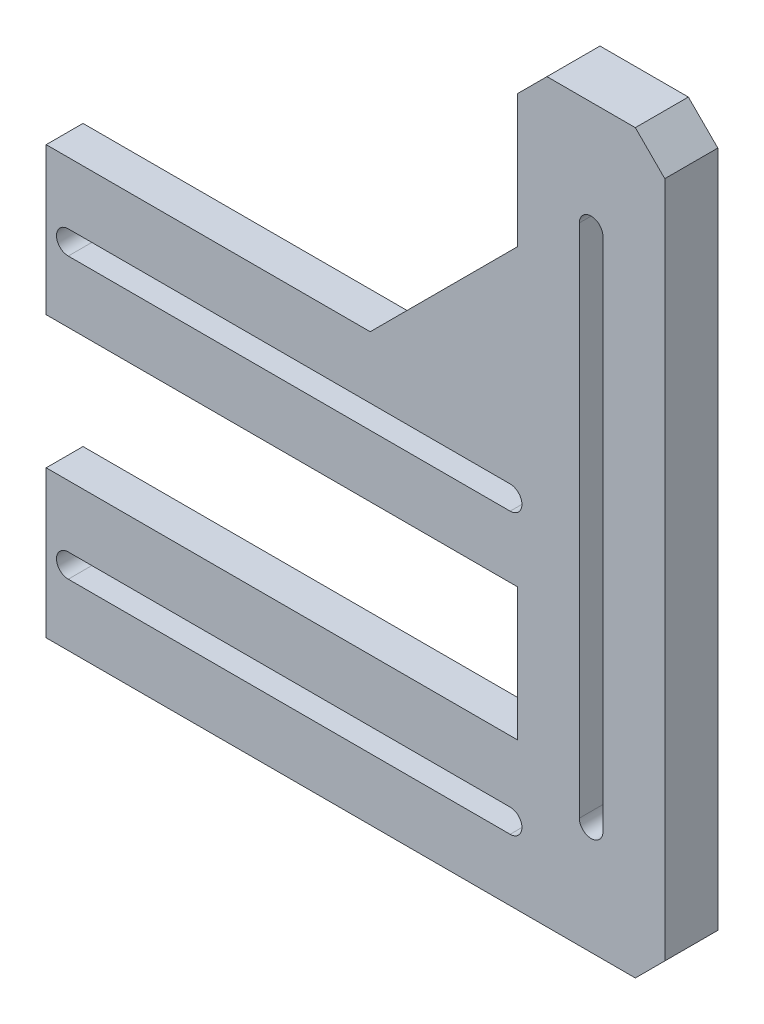
ISO-10303-21;
HEADER;
FILE_DESCRIPTION(('STEP AP214'),'2;1');
FILE_NAME('part.step','',(''),(''),'','','');
FILE_SCHEMA(('AUTOMOTIVE_DESIGN { 1 0 10303 214 1 1 1 1 }'));
ENDSEC;
DATA;
#1=APPLICATION_CONTEXT('core data for automotive mechanical design processes');
#2=APPLICATION_PROTOCOL_DEFINITION('international standard','automotive_design',2000,#1);
#3=PRODUCT_CONTEXT('',#1,'mechanical');
#4=PRODUCT('Part','Part','',(#3));
#5=PRODUCT_RELATED_PRODUCT_CATEGORY('part','',(#4));
#6=PRODUCT_DEFINITION_FORMATION('','',#4);
#7=PRODUCT_DEFINITION_CONTEXT('part definition',#1,'design');
#8=PRODUCT_DEFINITION('design','',#6,#7);
#9=PRODUCT_DEFINITION_SHAPE('','',#8);
#10=(LENGTH_UNIT() NAMED_UNIT(*) SI_UNIT(.MILLI.,.METRE.));
#11=(NAMED_UNIT(*) PLANE_ANGLE_UNIT() SI_UNIT($,.RADIAN.));
#12=(NAMED_UNIT(*) SI_UNIT($,.STERADIAN.) SOLID_ANGLE_UNIT());
#13=UNCERTAINTY_MEASURE_WITH_UNIT(LENGTH_MEASURE(1.E-05),#10,'distance_accuracy_value','');
#14=(GEOMETRIC_REPRESENTATION_CONTEXT(3) GLOBAL_UNCERTAINTY_ASSIGNED_CONTEXT((#13)) GLOBAL_UNIT_ASSIGNED_CONTEXT((#10,
#11,#12)) REPRESENTATION_CONTEXT('',''));
#15=CARTESIAN_POINT('',(0.,0.,0.));
#16=DIRECTION('',(0.,0.,1.));
#17=DIRECTION('',(1.,0.,0.));
#18=AXIS2_PLACEMENT_3D('',#15,#16,#17);
#19=CARTESIAN_POINT('',(0.,0.,5.));
#20=DIRECTION('',(0.,0.,1.));
#21=DIRECTION('',(1.,0.,0.));
#22=AXIS2_PLACEMENT_3D('',#19,#20,#21);
#23=PLANE('',#22);
#24=CARTESIAN_POINT('',(34.,14.,5.));
#25=DIRECTION('',(0.,0.,1.));
#26=DIRECTION('',(1.,0.,0.));
#27=AXIS2_PLACEMENT_3D('',#24,#25,#26);
#28=CIRCLE('',#27,1.59999999999999);
#29=CARTESIAN_POINT('',(34.,12.4,5.));
#30=VERTEX_POINT('',#29);
#31=CARTESIAN_POINT('',(34.,15.6,5.));
#32=VERTEX_POINT('',#31);
#33=EDGE_CURVE('E686',#30,#32,#28,.T.);
#34=ORIENTED_EDGE('',*,*,#33,.F.);
#35=DIRECTION('',(1.,0.,0.));
#36=VECTOR('',#35,1.);
#37=CARTESIAN_POINT('',(-26.,12.4,5.));
#38=LINE('',#37,#36);
#39=CARTESIAN_POINT('',(-26.,12.4,5.));
#40=VERTEX_POINT('',#39);
#41=EDGE_CURVE('E699',#40,#30,#38,.T.);
#42=ORIENTED_EDGE('',*,*,#41,.F.);
#43=CARTESIAN_POINT('',(-26.,14.,5.));
#44=DIRECTION('',(0.,0.,1.));
#45=DIRECTION('',(1.,0.,0.));
#46=AXIS2_PLACEMENT_3D('',#43,#44,#45);
#47=CIRCLE('',#46,1.59999999999999);
#48=CARTESIAN_POINT('',(-26.,15.6,5.));
#49=VERTEX_POINT('',#48);
#50=EDGE_CURVE('E694',#49,#40,#47,.T.);
#51=ORIENTED_EDGE('',*,*,#50,.F.);
#52=DIRECTION('',(1.,0.,0.));
#53=VECTOR('',#52,1.);
#54=CARTESIAN_POINT('',(-26.,15.6,5.));
#55=LINE('',#54,#53);
#56=EDGE_CURVE('E697',#49,#32,#55,.T.);
#57=ORIENTED_EDGE('',*,*,#56,.T.);
#58=EDGE_LOOP('',(#34,#42,#51,#57));
#59=FACE_BOUND('',#58,.T.);
#60=DIRECTION('',(-1.,0.,0.));
#61=VECTOR('',#60,1.);
#62=CARTESIAN_POINT('',(0.,66.,5.));
#63=LINE('',#62,#61);
#64=CARTESIAN_POINT('',(51.,66.,5.));
#65=VERTEX_POINT('',#64);
#66=CARTESIAN_POINT('',(39.,66.,5.));
#67=VERTEX_POINT('',#66);
#68=EDGE_CURVE('E587',#65,#67,#63,.T.);
#69=ORIENTED_EDGE('',*,*,#68,.T.);
#70=DIRECTION('',(-0.707106781186549,-0.707106781186546,0.));
#71=VECTOR('',#70,1.);
#72=CARTESIAN_POINT('',(-13.5000000000001,13.5000000000001,5.));
#73=LINE('',#72,#71);
#74=CARTESIAN_POINT('',(35.,62.,5.));
#75=VERTEX_POINT('',#74);
#76=EDGE_CURVE('E539',#67,#75,#73,.T.);
#77=ORIENTED_EDGE('',*,*,#76,.T.);
#78=DIRECTION('',(0.,1.,0.));
#79=VECTOR('',#78,1.);
#80=CARTESIAN_POINT('',(35.,0.,5.));
#81=LINE('',#80,#79);
#82=CARTESIAN_POINT('',(35.,44.,5.));
#83=VERTEX_POINT('',#82);
#84=EDGE_CURVE('E590',#83,#75,#81,.T.);
#85=ORIENTED_EDGE('',*,*,#84,.F.);
#86=DIRECTION('',(0.707106781186548,0.707106781186548,0.));
#87=VECTOR('',#86,1.);
#88=CARTESIAN_POINT('',(15.,24.,5.));
#89=LINE('',#88,#87);
#90=CARTESIAN_POINT('',(15.,24.,5.));
#91=VERTEX_POINT('',#90);
#92=EDGE_CURVE('E474',#91,#83,#89,.T.);
#93=ORIENTED_EDGE('',*,*,#92,.F.);
#94=DIRECTION('',(1.,0.,0.));
#95=VECTOR('',#94,1.);
#96=CARTESIAN_POINT('',(0.,24.,5.));
#97=LINE('',#96,#95);
#98=CARTESIAN_POINT('',(-29.,24.,5.));
#99=VERTEX_POINT('',#98);
#100=EDGE_CURVE('E482',#99,#91,#97,.T.);
#101=ORIENTED_EDGE('',*,*,#100,.F.);
#102=DIRECTION('',(0.,-1.,0.));
#103=VECTOR('',#102,1.);
#104=CARTESIAN_POINT('',(-29.,0.,5.));
#105=LINE('',#104,#103);
#106=CARTESIAN_POINT('',(-29.,4.,5.));
#107=VERTEX_POINT('',#106);
#108=EDGE_CURVE('E501',#99,#107,#105,.T.);
#109=ORIENTED_EDGE('',*,*,#108,.T.);
#110=DIRECTION('',(1.,0.,0.));
#111=VECTOR('',#110,1.);
#112=CARTESIAN_POINT('',(0.,4.,5.));
#113=LINE('',#112,#111);
#114=CARTESIAN_POINT('',(35.,4.,5.));
#115=VERTEX_POINT('',#114);
#116=EDGE_CURVE('E490',#107,#115,#113,.T.);
#117=ORIENTED_EDGE('',*,*,#116,.T.);
#118=DIRECTION('',(0.,1.,0.));
#119=VECTOR('',#118,1.);
#120=CARTESIAN_POINT('',(35.,0.,5.));
#121=LINE('',#120,#119);
#122=CARTESIAN_POINT('',(35.,-14.,5.));
#123=VERTEX_POINT('',#122);
#124=EDGE_CURVE('E577',#123,#115,#121,.T.);
#125=ORIENTED_EDGE('',*,*,#124,.F.);
#126=DIRECTION('',(1.,0.,0.));
#127=VECTOR('',#126,1.);
#128=CARTESIAN_POINT('',(0.,-14.,5.));
#129=LINE('',#128,#127);
#130=CARTESIAN_POINT('',(-29.,-14.,5.));
#131=VERTEX_POINT('',#130);
#132=EDGE_CURVE('E580',#131,#123,#129,.T.);
#133=ORIENTED_EDGE('',*,*,#132,.F.);
#134=DIRECTION('',(0.,1.,0.));
#135=VECTOR('',#134,1.);
#136=CARTESIAN_POINT('',(-29.,0.,5.));
#137=LINE('',#136,#135);
#138=CARTESIAN_POINT('',(-29.,-34.,5.));
#139=VERTEX_POINT('',#138);
#140=EDGE_CURVE('E582',#139,#131,#137,.T.);
#141=ORIENTED_EDGE('',*,*,#140,.F.);
#142=DIRECTION('',(1.,0.,0.));
#143=VECTOR('',#142,1.);
#144=CARTESIAN_POINT('',(0.,-34.,5.));
#145=LINE('',#144,#143);
#146=CARTESIAN_POINT('',(51.,-34.,5.));
#147=VERTEX_POINT('',#146);
#148=EDGE_CURVE('E584',#139,#147,#145,.T.);
#149=ORIENTED_EDGE('',*,*,#148,.T.);
#150=DIRECTION('',(0.707106781186549,0.707106781186546,0.));
#151=VECTOR('',#150,1.);
#152=CARTESIAN_POINT('',(42.4999999999999,-42.5000000000001,5.));
#153=LINE('',#152,#151);
#154=CARTESIAN_POINT('',(55.,-30.,5.));
#155=VERTEX_POINT('',#154);
#156=EDGE_CURVE('E276',#147,#155,#153,.T.);
#157=ORIENTED_EDGE('',*,*,#156,.T.);
#158=DIRECTION('',(0.,-1.,0.));
#159=VECTOR('',#158,1.);
#160=CARTESIAN_POINT('',(55.,0.,5.));
#161=LINE('',#160,#159);
#162=CARTESIAN_POINT('',(55.,62.,5.));
#163=VERTEX_POINT('',#162);
#164=EDGE_CURVE('E547',#163,#155,#161,.T.);
#165=ORIENTED_EDGE('',*,*,#164,.F.);
#166=DIRECTION('',(-0.707106781186546,0.707106781186549,0.));
#167=VECTOR('',#166,1.);
#168=CARTESIAN_POINT('',(58.5000000000001,58.4999999999999,5.));
#169=LINE('',#168,#167);
#170=EDGE_CURVE('E537',#163,#65,#169,.T.);
#171=ORIENTED_EDGE('',*,*,#170,.T.);
#172=EDGE_LOOP('',(#69,#77,#85,#93,#101,#109,#117,#125,#133,#141,#149,#157,#165,#171));
#173=FACE_BOUND('',#172,.T.);
#174=DIRECTION('',(1.,0.,0.));
#175=VECTOR('',#174,1.);
#176=CARTESIAN_POINT('',(-26.,-25.6000000000001,5.));
#177=LINE('',#176,#175);
#178=CARTESIAN_POINT('',(-26.,-25.6,5.));
#179=VERTEX_POINT('',#178);
#180=CARTESIAN_POINT('',(34.,-25.6,5.));
#181=VERTEX_POINT('',#180);
#182=EDGE_CURVE('E664',#179,#181,#177,.T.);
#183=ORIENTED_EDGE('',*,*,#182,.F.);
#184=CARTESIAN_POINT('',(-26.,-24.,5.));
#185=DIRECTION('',(0.,0.,1.));
#186=DIRECTION('',(1.,0.,0.));
#187=AXIS2_PLACEMENT_3D('',#184,#185,#186);
#188=CIRCLE('',#187,1.59999999999999);
#189=CARTESIAN_POINT('',(-26.,-22.4,5.));
#190=VERTEX_POINT('',#189);
#191=EDGE_CURVE('E658',#190,#179,#188,.T.);
#192=ORIENTED_EDGE('',*,*,#191,.F.);
#193=DIRECTION('',(1.,0.,0.));
#194=VECTOR('',#193,1.);
#195=CARTESIAN_POINT('',(-26.,-22.4,5.));
#196=LINE('',#195,#194);
#197=CARTESIAN_POINT('',(34.,-22.4,5.));
#198=VERTEX_POINT('',#197);
#199=EDGE_CURVE('E661',#190,#198,#196,.T.);
#200=ORIENTED_EDGE('',*,*,#199,.T.);
#201=CARTESIAN_POINT('',(34.,-24.,5.));
#202=DIRECTION('',(0.,0.,1.));
#203=DIRECTION('',(1.,0.,0.));
#204=AXIS2_PLACEMENT_3D('',#201,#202,#203);
#205=CIRCLE('',#204,1.59999999999999);
#206=EDGE_CURVE('E650',#181,#198,#205,.T.);
#207=ORIENTED_EDGE('',*,*,#206,.F.);
#208=EDGE_LOOP('',(#183,#192,#200,#207));
#209=FACE_BOUND('',#208,.T.);
#210=CARTESIAN_POINT('',(45.,-19.,5.));
#211=DIRECTION('',(0.,0.,1.));
#212=DIRECTION('',(1.,0.,0.));
#213=AXIS2_PLACEMENT_3D('',#210,#211,#212);
#214=CIRCLE('',#213,1.59999999999998);
#215=CARTESIAN_POINT('',(43.4,-19.,5.));
#216=VERTEX_POINT('',#215);
#217=CARTESIAN_POINT('',(46.6,-19.,5.));
#218=VERTEX_POINT('',#217);
#219=EDGE_CURVE('E716',#216,#218,#214,.T.);
#220=ORIENTED_EDGE('',*,*,#219,.F.);
#221=DIRECTION('',(0.,1.,0.));
#222=VECTOR('',#221,1.);
#223=CARTESIAN_POINT('',(43.4,-19.,5.));
#224=LINE('',#223,#222);
#225=CARTESIAN_POINT('',(43.4,51.,5.));
#226=VERTEX_POINT('',#225);
#227=EDGE_CURVE('E721',#216,#226,#224,.T.);
#228=ORIENTED_EDGE('',*,*,#227,.T.);
#229=CARTESIAN_POINT('',(45.,51.,5.));
#230=DIRECTION('',(0.,0.,1.));
#231=DIRECTION('',(1.,0.,0.));
#232=AXIS2_PLACEMENT_3D('',#229,#230,#231);
#233=CIRCLE('',#232,1.59999999999998);
#234=CARTESIAN_POINT('',(46.6,51.,5.));
#235=VERTEX_POINT('',#234);
#236=EDGE_CURVE('E706',#235,#226,#233,.T.);
#237=ORIENTED_EDGE('',*,*,#236,.F.);
#238=DIRECTION('',(0.,1.,0.));
#239=VECTOR('',#238,1.);
#240=CARTESIAN_POINT('',(46.6,-19.,5.));
#241=LINE('',#240,#239);
#242=EDGE_CURVE('E729',#218,#235,#241,.T.);
#243=ORIENTED_EDGE('',*,*,#242,.F.);
#244=EDGE_LOOP('',(#220,#228,#237,#243));
#245=FACE_BOUND('',#244,.T.);
#246=ADVANCED_FACE('F260',(#59,#173,#209,#245),#23,.T.);
#247=CARTESIAN_POINT('',(35.,0.,5.));
#248=DIRECTION('',(-1.,0.,0.));
#249=DIRECTION('',(0.,0.,1.));
#250=AXIS2_PLACEMENT_3D('',#247,#248,#249);
#251=PLANE('',#250);
#252=DIRECTION('',(0.,0.,-1.));
#253=VECTOR('',#252,1.);
#254=CARTESIAN_POINT('',(35.,4.,5.));
#255=LINE('',#254,#253);
#256=CARTESIAN_POINT('',(35.,4.,0.));
#257=VERTEX_POINT('',#256);
#258=EDGE_CURVE('E511',#115,#257,#255,.T.);
#259=ORIENTED_EDGE('',*,*,#258,.T.);
#260=DIRECTION('',(0.,1.,0.));
#261=VECTOR('',#260,1.);
#262=CARTESIAN_POINT('',(35.,-34.,0.));
#263=LINE('',#262,#261);
#264=CARTESIAN_POINT('',(35.,12.7510004003203,0.));
#265=VERTEX_POINT('',#264);
#266=EDGE_CURVE('E519',#257,#265,#263,.T.);
#267=ORIENTED_EDGE('',*,*,#266,.T.);
#268=DIRECTION('',(0.,0.,1.));
#269=VECTOR('',#268,1.);
#270=CARTESIAN_POINT('',(35.,12.7510004003203,5.));
#271=LINE('',#270,#269);
#272=CARTESIAN_POINT('',(35.,12.7510004003203,-2.2));
#273=VERTEX_POINT('',#272);
#274=EDGE_CURVE('E627',#273,#265,#271,.T.);
#275=ORIENTED_EDGE('',*,*,#274,.F.);
#276=DIRECTION('',(0.,1.,0.));
#277=VECTOR('',#276,1.);
#278=CARTESIAN_POINT('',(35.,-34.,-2.2));
#279=LINE('',#278,#277);
#280=CARTESIAN_POINT('',(35.,-22.7510004003203,-2.2));
#281=VERTEX_POINT('',#280);
#282=EDGE_CURVE('E570',#281,#273,#279,.T.);
#283=ORIENTED_EDGE('',*,*,#282,.F.);
#284=DIRECTION('',(0.,0.,1.));
#285=VECTOR('',#284,1.);
#286=CARTESIAN_POINT('',(35.,-22.7510004003203,5.));
#287=LINE('',#286,#285);
#288=CARTESIAN_POINT('',(35.,-22.7510004003203,0.));
#289=VERTEX_POINT('',#288);
#290=EDGE_CURVE('E643',#289,#281,#287,.F.);
#291=ORIENTED_EDGE('',*,*,#290,.F.);
#292=CARTESIAN_POINT('',(35.,-14.,0.));
#293=VERTEX_POINT('',#292);
#294=EDGE_CURVE('E560',#289,#293,#263,.T.);
#295=ORIENTED_EDGE('',*,*,#294,.T.);
#296=DIRECTION('',(0.,0.,-1.));
#297=VECTOR('',#296,1.);
#298=CARTESIAN_POINT('',(35.,-14.,5.));
#299=LINE('',#298,#297);
#300=EDGE_CURVE('E508',#123,#293,#299,.T.);
#301=ORIENTED_EDGE('',*,*,#300,.F.);
#302=ORIENTED_EDGE('',*,*,#124,.T.);
#303=EDGE_LOOP('',(#259,#267,#275,#283,#291,#295,#301,#302));
#304=FACE_BOUND('',#303,.T.);
#305=ADVANCED_FACE('F614',(#304),#251,.T.);
#306=DIRECTION('',(0.,0.,1.));
#307=VECTOR('',#306,1.);
#308=CARTESIAN_POINT('',(35.,-25.2489995996797,5.));
#309=LINE('',#308,#307);
#310=CARTESIAN_POINT('',(35.,-25.2489995996797,-2.2));
#311=VERTEX_POINT('',#310);
#312=CARTESIAN_POINT('',(35.,-25.2489995996797,0.));
#313=VERTEX_POINT('',#312);
#314=EDGE_CURVE('E639',#311,#313,#309,.T.);
#315=ORIENTED_EDGE('',*,*,#314,.F.);
#316=CARTESIAN_POINT('',(35.,-34.,-2.2));
#317=VERTEX_POINT('',#316);
#318=EDGE_CURVE('E566',#317,#311,#279,.T.);
#319=ORIENTED_EDGE('',*,*,#318,.F.);
#320=DIRECTION('',(0.,0.,1.));
#321=VECTOR('',#320,1.);
#322=CARTESIAN_POINT('',(35.,-34.,-2.2));
#323=LINE('',#322,#321);
#324=CARTESIAN_POINT('',(35.,-34.,0.));
#325=VERTEX_POINT('',#324);
#326=EDGE_CURVE('E571',#317,#325,#323,.T.);
#327=ORIENTED_EDGE('',*,*,#326,.T.);
#328=EDGE_CURVE('E555',#325,#313,#263,.T.);
#329=ORIENTED_EDGE('',*,*,#328,.T.);
#330=EDGE_LOOP('',(#315,#319,#327,#329));
#331=FACE_BOUND('',#330,.T.);
#332=ADVANCED_FACE('F762',(#331),#251,.T.);
#333=CARTESIAN_POINT('',(0.,0.,0.));
#334=DIRECTION('',(0.,0.,1.));
#335=DIRECTION('',(1.,0.,0.));
#336=AXIS2_PLACEMENT_3D('',#333,#334,#335);
#337=PLANE('',#336);
#338=DIRECTION('',(0.,1.,0.));
#339=VECTOR('',#338,1.);
#340=CARTESIAN_POINT('',(-29.,0.,0.));
#341=LINE('',#340,#339);
#342=CARTESIAN_POINT('',(-29.,-34.,0.));
#343=VERTEX_POINT('',#342);
#344=CARTESIAN_POINT('',(-29.,-14.,0.));
#345=VERTEX_POINT('',#344);
#346=EDGE_CURVE('E493',#343,#345,#341,.T.);
#347=ORIENTED_EDGE('',*,*,#346,.T.);
#348=DIRECTION('',(1.,0.,0.));
#349=VECTOR('',#348,1.);
#350=CARTESIAN_POINT('',(0.,-14.,0.));
#351=LINE('',#350,#349);
#352=EDGE_CURVE('E596',#345,#293,#351,.T.);
#353=ORIENTED_EDGE('',*,*,#352,.T.);
#354=ORIENTED_EDGE('',*,*,#294,.F.);
#355=CARTESIAN_POINT('',(34.,-24.,0.));
#356=DIRECTION('',(0.,0.,1.));
#357=DIRECTION('',(1.,0.,0.));
#358=AXIS2_PLACEMENT_3D('',#355,#356,#357);
#359=CIRCLE('',#358,1.59999999999999);
#360=CARTESIAN_POINT('',(34.,-22.4,0.));
#361=VERTEX_POINT('',#360);
#362=EDGE_CURVE('E641',#289,#361,#359,.T.);
#363=ORIENTED_EDGE('',*,*,#362,.T.);
#364=DIRECTION('',(-1.,0.,0.));
#365=VECTOR('',#364,1.);
#366=CARTESIAN_POINT('',(0.,-22.4,0.));
#367=LINE('',#366,#365);
#368=CARTESIAN_POINT('',(-26.,-22.4,0.));
#369=VERTEX_POINT('',#368);
#370=EDGE_CURVE('E631',#361,#369,#367,.T.);
#371=ORIENTED_EDGE('',*,*,#370,.T.);
#372=CARTESIAN_POINT('',(-26.,-24.,0.));
#373=DIRECTION('',(0.,0.,1.));
#374=DIRECTION('',(1.,0.,0.));
#375=AXIS2_PLACEMENT_3D('',#372,#373,#374);
#376=CIRCLE('',#375,1.59999999999999);
#377=CARTESIAN_POINT('',(-26.,-25.6,0.));
#378=VERTEX_POINT('',#377);
#379=EDGE_CURVE('E563',#369,#378,#376,.T.);
#380=ORIENTED_EDGE('',*,*,#379,.T.);
#381=DIRECTION('',(1.,0.,0.));
#382=VECTOR('',#381,1.);
#383=CARTESIAN_POINT('',(0.,-25.6,0.));
#384=LINE('',#383,#382);
#385=CARTESIAN_POINT('',(34.,-25.6,0.));
#386=VERTEX_POINT('',#385);
#387=EDGE_CURVE('E634',#378,#386,#384,.T.);
#388=ORIENTED_EDGE('',*,*,#387,.T.);
#389=EDGE_CURVE('E636',#386,#313,#359,.T.);
#390=ORIENTED_EDGE('',*,*,#389,.T.);
#391=ORIENTED_EDGE('',*,*,#328,.F.);
#392=DIRECTION('',(1.,0.,0.));
#393=VECTOR('',#392,1.);
#394=CARTESIAN_POINT('',(0.,-34.,0.));
#395=LINE('',#394,#393);
#396=EDGE_CURVE('E488',#343,#325,#395,.T.);
#397=ORIENTED_EDGE('',*,*,#396,.F.);
#398=EDGE_LOOP('',(#347,#353,#354,#363,#371,#380,#388,#390,#391,#397));
#399=FACE_BOUND('',#398,.T.);
#400=ADVANCED_FACE('F600',(#399),#337,.F.);
#401=DIRECTION('',(-1.,0.,0.));
#402=VECTOR('',#401,1.);
#403=CARTESIAN_POINT('',(0.,15.6,0.));
#404=LINE('',#403,#402);
#405=CARTESIAN_POINT('',(34.,15.6,0.));
#406=VERTEX_POINT('',#405);
#407=CARTESIAN_POINT('',(-26.,15.6,0.));
#408=VERTEX_POINT('',#407);
#409=EDGE_CURVE('E666',#406,#408,#404,.T.);
#410=ORIENTED_EDGE('',*,*,#409,.T.);
#411=CARTESIAN_POINT('',(-26.,14.,0.));
#412=DIRECTION('',(0.,0.,1.));
#413=DIRECTION('',(1.,0.,0.));
#414=AXIS2_PLACEMENT_3D('',#411,#412,#413);
#415=CIRCLE('',#414,1.59999999999999);
#416=CARTESIAN_POINT('',(-26.,12.4,0.));
#417=VERTEX_POINT('',#416);
#418=EDGE_CURVE('E668',#408,#417,#415,.T.);
#419=ORIENTED_EDGE('',*,*,#418,.T.);
#420=DIRECTION('',(1.,0.,0.));
#421=VECTOR('',#420,1.);
#422=CARTESIAN_POINT('',(0.,12.4,0.));
#423=LINE('',#422,#421);
#424=CARTESIAN_POINT('',(34.,12.4,0.));
#425=VERTEX_POINT('',#424);
#426=EDGE_CURVE('E671',#417,#425,#423,.T.);
#427=ORIENTED_EDGE('',*,*,#426,.T.);
#428=CARTESIAN_POINT('',(34.,14.,0.));
#429=DIRECTION('',(0.,0.,1.));
#430=DIRECTION('',(1.,0.,0.));
#431=AXIS2_PLACEMENT_3D('',#428,#429,#430);
#432=CIRCLE('',#431,1.59999999999999);
#433=EDGE_CURVE('E673',#425,#265,#432,.T.);
#434=ORIENTED_EDGE('',*,*,#433,.T.);
#435=ORIENTED_EDGE('',*,*,#266,.F.);
#436=DIRECTION('',(1.,0.,0.));
#437=VECTOR('',#436,1.);
#438=CARTESIAN_POINT('',(0.,4.,0.));
#439=LINE('',#438,#437);
#440=CARTESIAN_POINT('',(-29.,4.,0.));
#441=VERTEX_POINT('',#440);
#442=EDGE_CURVE('E575',#441,#257,#439,.T.);
#443=ORIENTED_EDGE('',*,*,#442,.F.);
#444=DIRECTION('',(0.,-1.,0.));
#445=VECTOR('',#444,1.);
#446=CARTESIAN_POINT('',(-29.,0.,0.));
#447=LINE('',#446,#445);
#448=CARTESIAN_POINT('',(-29.,24.,0.));
#449=VERTEX_POINT('',#448);
#450=EDGE_CURVE('E487',#449,#441,#447,.T.);
#451=ORIENTED_EDGE('',*,*,#450,.F.);
#452=DIRECTION('',(1.,0.,0.));
#453=VECTOR('',#452,1.);
#454=CARTESIAN_POINT('',(0.,24.,0.));
#455=LINE('',#454,#453);
#456=CARTESIAN_POINT('',(15.,24.,0.));
#457=VERTEX_POINT('',#456);
#458=EDGE_CURVE('E480',#449,#457,#455,.T.);
#459=ORIENTED_EDGE('',*,*,#458,.T.);
#460=DIRECTION('',(0.707106781186548,0.707106781186548,0.));
#461=VECTOR('',#460,1.);
#462=CARTESIAN_POINT('',(15.,24.,0.));
#463=LINE('',#462,#461);
#464=CARTESIAN_POINT('',(35.,44.,0.));
#465=VERTEX_POINT('',#464);
#466=EDGE_CURVE('E464',#457,#465,#463,.T.);
#467=ORIENTED_EDGE('',*,*,#466,.T.);
#468=CARTESIAN_POINT('',(35.,15.2489995996797,0.));
#469=VERTEX_POINT('',#468);
#470=EDGE_CURVE('E514',#469,#465,#263,.T.);
#471=ORIENTED_EDGE('',*,*,#470,.F.);
#472=EDGE_CURVE('E675',#469,#406,#432,.T.);
#473=ORIENTED_EDGE('',*,*,#472,.T.);
#474=EDGE_LOOP('',(#410,#419,#427,#434,#435,#443,#451,#459,#467,#471,#473));
#475=FACE_BOUND('',#474,.T.);
#476=ADVANCED_FACE('F485',(#475),#337,.F.);
#477=CARTESIAN_POINT('',(0.,4.,5.));
#478=DIRECTION('',(0.,1.,0.));
#479=DIRECTION('',(-1.,0.,0.));
#480=AXIS2_PLACEMENT_3D('',#477,#478,#479);
#481=PLANE('',#480);
#482=ORIENTED_EDGE('',*,*,#442,.T.);
#483=ORIENTED_EDGE('',*,*,#258,.F.);
#484=ORIENTED_EDGE('',*,*,#116,.F.);
#485=DIRECTION('',(0.,0.,-1.));
#486=VECTOR('',#485,1.);
#487=CARTESIAN_POINT('',(-29.,4.,5.));
#488=LINE('',#487,#486);
#489=EDGE_CURVE('E497',#107,#441,#488,.T.);
#490=ORIENTED_EDGE('',*,*,#489,.T.);
#491=EDGE_LOOP('',(#482,#483,#484,#490));
#492=FACE_BOUND('',#491,.T.);
#493=ADVANCED_FACE('F622',(#492),#481,.F.);
#494=CARTESIAN_POINT('',(0.,-14.,5.));
#495=DIRECTION('',(0.,1.,0.));
#496=DIRECTION('',(0.,0.,1.));
#497=AXIS2_PLACEMENT_3D('',#494,#495,#496);
#498=PLANE('',#497);
#499=ORIENTED_EDGE('',*,*,#132,.T.);
#500=ORIENTED_EDGE('',*,*,#300,.T.);
#501=ORIENTED_EDGE('',*,*,#352,.F.);
#502=DIRECTION('',(0.,0.,-1.));
#503=VECTOR('',#502,1.);
#504=CARTESIAN_POINT('',(-29.,-14.,5.));
#505=LINE('',#504,#503);
#506=EDGE_CURVE('E505',#131,#345,#505,.T.);
#507=ORIENTED_EDGE('',*,*,#506,.F.);
#508=EDGE_LOOP('',(#499,#500,#501,#507));
#509=FACE_BOUND('',#508,.T.);
#510=ADVANCED_FACE('F610',(#509),#498,.T.);
#511=CARTESIAN_POINT('',(-29.,0.,5.));
#512=DIRECTION('',(-1.,0.,0.));
#513=DIRECTION('',(0.,0.,1.));
#514=AXIS2_PLACEMENT_3D('',#511,#512,#513);
#515=PLANE('',#514);
#516=ORIENTED_EDGE('',*,*,#506,.T.);
#517=ORIENTED_EDGE('',*,*,#346,.F.);
#518=DIRECTION('',(0.,0.,-1.));
#519=VECTOR('',#518,1.);
#520=CARTESIAN_POINT('',(-29.,-34.,5.));
#521=LINE('',#520,#519);
#522=EDGE_CURVE('E503',#139,#343,#521,.T.);
#523=ORIENTED_EDGE('',*,*,#522,.F.);
#524=ORIENTED_EDGE('',*,*,#140,.T.);
#525=EDGE_LOOP('',(#516,#517,#523,#524));
#526=FACE_BOUND('',#525,.T.);
#527=ADVANCED_FACE('F606',(#526),#515,.T.);
#528=CARTESIAN_POINT('',(0.,-34.,5.));
#529=DIRECTION('',(0.,1.,0.));
#530=DIRECTION('',(0.,0.,1.));
#531=AXIS2_PLACEMENT_3D('',#528,#529,#530);
#532=PLANE('',#531);
#533=DIRECTION('',(-1.,0.,0.));
#534=VECTOR('',#533,1.);
#535=CARTESIAN_POINT('',(55.,-34.,-2.2));
#536=LINE('',#535,#534);
#537=CARTESIAN_POINT('',(51.,-34.,-2.2));
#538=VERTEX_POINT('',#537);
#539=EDGE_CURVE('E554',#538,#317,#536,.T.);
#540=ORIENTED_EDGE('',*,*,#539,.F.);
#541=DIRECTION('',(0.,0.,1.));
#542=VECTOR('',#541,1.);
#543=CARTESIAN_POINT('',(51.,-34.,5.));
#544=LINE('',#543,#542);
#545=EDGE_CURVE('E13',#538,#147,#544,.T.);
#546=ORIENTED_EDGE('',*,*,#545,.T.);
#547=ORIENTED_EDGE('',*,*,#148,.F.);
#548=ORIENTED_EDGE('',*,*,#522,.T.);
#549=ORIENTED_EDGE('',*,*,#396,.T.);
#550=ORIENTED_EDGE('',*,*,#326,.F.);
#551=EDGE_LOOP('',(#540,#546,#547,#548,#549,#550));
#552=FACE_BOUND('',#551,.T.);
#553=ADVANCED_FACE('F766',(#552),#532,.F.);
#554=CARTESIAN_POINT('',(55.,0.,5.));
#555=DIRECTION('',(1.,0.,0.));
#556=DIRECTION('',(0.,0.,-1.));
#557=AXIS2_PLACEMENT_3D('',#554,#555,#556);
#558=PLANE('',#557);
#559=DIRECTION('',(0.,-1.,0.));
#560=VECTOR('',#559,1.);
#561=CARTESIAN_POINT('',(55.,-34.,-2.2));
#562=LINE('',#561,#560);
#563=CARTESIAN_POINT('',(55.,62.,-2.2));
#564=VERTEX_POINT('',#563);
#565=CARTESIAN_POINT('',(55.,-30.,-2.2));
#566=VERTEX_POINT('',#565);
#567=EDGE_CURVE('E546',#564,#566,#562,.T.);
#568=ORIENTED_EDGE('',*,*,#567,.F.);
#569=DIRECTION('',(0.,0.,1.));
#570=VECTOR('',#569,1.);
#571=CARTESIAN_POINT('',(55.,62.,5.));
#572=LINE('',#571,#570);
#573=EDGE_CURVE('E269',#564,#163,#572,.T.);
#574=ORIENTED_EDGE('',*,*,#573,.T.);
#575=ORIENTED_EDGE('',*,*,#164,.T.);
#576=DIRECTION('',(0.,0.,-1.));
#577=VECTOR('',#576,1.);
#578=CARTESIAN_POINT('',(55.,-30.,-2.2));
#579=LINE('',#578,#577);
#580=EDGE_CURVE('E541',#155,#566,#579,.T.);
#581=ORIENTED_EDGE('',*,*,#580,.T.);
#582=EDGE_LOOP('',(#568,#574,#575,#581));
#583=FACE_BOUND('',#582,.T.);
#584=ADVANCED_FACE('F545',(#583),#558,.T.);
#585=CARTESIAN_POINT('',(0.,66.,5.));
#586=DIRECTION('',(0.,-1.,0.));
#587=DIRECTION('',(0.,0.,-1.));
#588=AXIS2_PLACEMENT_3D('',#585,#586,#587);
#589=PLANE('',#588);
#590=DIRECTION('',(1.,0.,0.));
#591=VECTOR('',#590,1.);
#592=CARTESIAN_POINT('',(55.,66.,-2.2));
#593=LINE('',#592,#591);
#594=CARTESIAN_POINT('',(39.,66.,-2.2));
#595=VERTEX_POINT('',#594);
#596=CARTESIAN_POINT('',(51.,66.,-2.2));
#597=VERTEX_POINT('',#596);
#598=EDGE_CURVE('E569',#595,#597,#593,.T.);
#599=ORIENTED_EDGE('',*,*,#598,.F.);
#600=DIRECTION('',(0.,0.,1.));
#601=VECTOR('',#600,1.);
#602=CARTESIAN_POINT('',(39.,66.,5.));
#603=LINE('',#602,#601);
#604=EDGE_CURVE('E534',#595,#67,#603,.T.);
#605=ORIENTED_EDGE('',*,*,#604,.T.);
#606=ORIENTED_EDGE('',*,*,#68,.F.);
#607=DIRECTION('',(0.,0.,-1.));
#608=VECTOR('',#607,1.);
#609=CARTESIAN_POINT('',(51.,66.,-2.2));
#610=LINE('',#609,#608);
#611=EDGE_CURVE('E531',#65,#597,#610,.T.);
#612=ORIENTED_EDGE('',*,*,#611,.T.);
#613=EDGE_LOOP('',(#599,#605,#606,#612));
#614=FACE_BOUND('',#613,.T.);
#615=ADVANCED_FACE('F795',(#614),#589,.F.);
#616=ORIENTED_EDGE('',*,*,#84,.T.);
#617=DIRECTION('',(0.,0.,-1.));
#618=VECTOR('',#617,1.);
#619=CARTESIAN_POINT('',(35.,62.,-2.2));
#620=LINE('',#619,#618);
#621=CARTESIAN_POINT('',(35.,62.,-2.2));
#622=VERTEX_POINT('',#621);
#623=EDGE_CURVE('E522',#75,#622,#620,.T.);
#624=ORIENTED_EDGE('',*,*,#623,.T.);
#625=CARTESIAN_POINT('',(35.,15.2489995996797,-2.2));
#626=VERTEX_POINT('',#625);
#627=EDGE_CURVE('E557',#626,#622,#279,.T.);
#628=ORIENTED_EDGE('',*,*,#627,.F.);
#629=DIRECTION('',(0.,0.,1.));
#630=VECTOR('',#629,1.);
#631=CARTESIAN_POINT('',(35.,15.2489995996797,5.));
#632=LINE('',#631,#630);
#633=EDGE_CURVE('E678',#469,#626,#632,.F.);
#634=ORIENTED_EDGE('',*,*,#633,.F.);
#635=ORIENTED_EDGE('',*,*,#470,.T.);
#636=DIRECTION('',(0.,0.,1.));
#637=VECTOR('',#636,1.);
#638=CARTESIAN_POINT('',(35.,44.,5.));
#639=LINE('',#638,#637);
#640=EDGE_CURVE('E470',#83,#465,#639,.F.);
#641=ORIENTED_EDGE('',*,*,#640,.F.);
#642=EDGE_LOOP('',(#616,#624,#628,#634,#635,#641));
#643=FACE_BOUND('',#642,.T.);
#644=ADVANCED_FACE('F734',(#643),#251,.T.);
#645=CARTESIAN_POINT('',(0.,24.,5.));
#646=DIRECTION('',(0.,1.,0.));
#647=DIRECTION('',(0.,0.,1.));
#648=AXIS2_PLACEMENT_3D('',#645,#646,#647);
#649=PLANE('',#648);
#650=DIRECTION('',(0.,0.,-1.));
#651=VECTOR('',#650,1.);
#652=CARTESIAN_POINT('',(15.,24.,5.));
#653=LINE('',#652,#651);
#654=EDGE_CURVE('E467',#457,#91,#653,.F.);
#655=ORIENTED_EDGE('',*,*,#654,.F.);
#656=ORIENTED_EDGE('',*,*,#458,.F.);
#657=DIRECTION('',(0.,0.,-1.));
#658=VECTOR('',#657,1.);
#659=CARTESIAN_POINT('',(-29.,24.,5.));
#660=LINE('',#659,#658);
#661=EDGE_CURVE('E500',#99,#449,#660,.T.);
#662=ORIENTED_EDGE('',*,*,#661,.F.);
#663=ORIENTED_EDGE('',*,*,#100,.T.);
#664=EDGE_LOOP('',(#655,#656,#662,#663));
#665=FACE_BOUND('',#664,.T.);
#666=ADVANCED_FACE('F479',(#665),#649,.T.);
#667=CARTESIAN_POINT('',(-29.,0.,5.));
#668=DIRECTION('',(1.,0.,0.));
#669=DIRECTION('',(0.,1.,0.));
#670=AXIS2_PLACEMENT_3D('',#667,#668,#669);
#671=PLANE('',#670);
#672=ORIENTED_EDGE('',*,*,#450,.T.);
#673=ORIENTED_EDGE('',*,*,#489,.F.);
#674=ORIENTED_EDGE('',*,*,#108,.F.);
#675=ORIENTED_EDGE('',*,*,#661,.T.);
#676=EDGE_LOOP('',(#672,#673,#674,#675));
#677=FACE_BOUND('',#676,.T.);
#678=ADVANCED_FACE('F788',(#677),#671,.F.);
#679=CARTESIAN_POINT('',(0.,0.,-2.2));
#680=DIRECTION('',(0.,0.,1.));
#681=DIRECTION('',(1.,0.,0.));
#682=AXIS2_PLACEMENT_3D('',#679,#680,#681);
#683=PLANE('',#682);
#684=DIRECTION('',(0.,1.,0.));
#685=VECTOR('',#684,1.);
#686=CARTESIAN_POINT('',(46.6,-19.,-2.2));
#687=LINE('',#686,#685);
#688=CARTESIAN_POINT('',(46.6,-19.,-2.2));
#689=VERTEX_POINT('',#688);
#690=CARTESIAN_POINT('',(46.6,51.,-2.2));
#691=VERTEX_POINT('',#690);
#692=EDGE_CURVE('E726',#689,#691,#687,.T.);
#693=ORIENTED_EDGE('',*,*,#692,.T.);
#694=CARTESIAN_POINT('',(45.,51.,-2.2));
#695=DIRECTION('',(0.,0.,1.));
#696=DIRECTION('',(1.,0.,0.));
#697=AXIS2_PLACEMENT_3D('',#694,#695,#696);
#698=CIRCLE('',#697,1.6);
#699=CARTESIAN_POINT('',(43.4,51.,-2.2));
#700=VERTEX_POINT('',#699);
#701=EDGE_CURVE('E703',#691,#700,#698,.T.);
#702=ORIENTED_EDGE('',*,*,#701,.T.);
#703=DIRECTION('',(0.,1.,0.));
#704=VECTOR('',#703,1.);
#705=CARTESIAN_POINT('',(43.4,-19.,-2.2));
#706=LINE('',#705,#704);
#707=CARTESIAN_POINT('',(43.4,-19.,-2.2));
#708=VERTEX_POINT('',#707);
#709=EDGE_CURVE('E724',#708,#700,#706,.T.);
#710=ORIENTED_EDGE('',*,*,#709,.F.);
#711=CARTESIAN_POINT('',(45.,-19.,-2.2));
#712=DIRECTION('',(0.,0.,1.));
#713=DIRECTION('',(1.,0.,0.));
#714=AXIS2_PLACEMENT_3D('',#711,#712,#713);
#715=CIRCLE('',#714,1.6);
#716=EDGE_CURVE('E713',#708,#689,#715,.T.);
#717=ORIENTED_EDGE('',*,*,#716,.T.);
#718=EDGE_LOOP('',(#693,#702,#710,#717));
#719=FACE_BOUND('',#718,.T.);
#720=ORIENTED_EDGE('',*,*,#627,.T.);
#721=DIRECTION('',(0.707106781186549,0.707106781186546,0.));
#722=VECTOR('',#721,1.);
#723=CARTESIAN_POINT('',(35.,62.,-2.2));
#724=LINE('',#723,#722);
#725=EDGE_CURVE('E529',#622,#595,#724,.T.);
#726=ORIENTED_EDGE('',*,*,#725,.T.);
#727=ORIENTED_EDGE('',*,*,#598,.T.);
#728=DIRECTION('',(0.707106781186546,-0.707106781186549,0.));
#729=VECTOR('',#728,1.);
#730=CARTESIAN_POINT('',(51.,66.,-2.2));
#731=LINE('',#730,#729);
#732=EDGE_CURVE('E527',#597,#564,#731,.T.);
#733=ORIENTED_EDGE('',*,*,#732,.T.);
#734=ORIENTED_EDGE('',*,*,#567,.T.);
#735=DIRECTION('',(-0.707106781186549,-0.707106781186546,0.));
#736=VECTOR('',#735,1.);
#737=CARTESIAN_POINT('',(55.,-30.,-2.2));
#738=LINE('',#737,#736);
#739=EDGE_CURVE('E525',#566,#538,#738,.T.);
#740=ORIENTED_EDGE('',*,*,#739,.T.);
#741=ORIENTED_EDGE('',*,*,#539,.T.);
#742=ORIENTED_EDGE('',*,*,#318,.T.);
#743=CARTESIAN_POINT('',(34.,-24.,-2.2));
#744=DIRECTION('',(0.,0.,1.));
#745=DIRECTION('',(1.,0.,0.));
#746=AXIS2_PLACEMENT_3D('',#743,#744,#745);
#747=CIRCLE('',#746,1.59999999999999);
#748=EDGE_CURVE('E515',#311,#281,#747,.T.);
#749=ORIENTED_EDGE('',*,*,#748,.T.);
#750=ORIENTED_EDGE('',*,*,#282,.T.);
#751=CARTESIAN_POINT('',(34.,14.,-2.2));
#752=DIRECTION('',(0.,0.,1.));
#753=DIRECTION('',(1.,0.,0.));
#754=AXIS2_PLACEMENT_3D('',#751,#752,#753);
#755=CIRCLE('',#754,1.59999999999999);
#756=EDGE_CURVE('E518',#273,#626,#755,.T.);
#757=ORIENTED_EDGE('',*,*,#756,.T.);
#758=EDGE_LOOP('',(#720,#726,#727,#733,#734,#740,#741,#742,#749,#750,#757));
#759=FACE_BOUND('',#758,.T.);
#760=ADVANCED_FACE('F551',(#719,#759),#683,.F.);
#761=CARTESIAN_POINT('',(-26.,-24.,5.));
#762=DIRECTION('',(0.,0.,1.));
#763=DIRECTION('',(1.,0.,0.));
#764=AXIS2_PLACEMENT_3D('',#761,#762,#763);
#765=CYLINDRICAL_SURFACE('',#764,1.59999999999999);
#766=DIRECTION('',(0.,0.,1.));
#767=VECTOR('',#766,1.);
#768=CARTESIAN_POINT('',(-26.,-22.4,5.));
#769=LINE('',#768,#767);
#770=EDGE_CURVE('E653',#190,#369,#769,.F.);
#771=ORIENTED_EDGE('',*,*,#770,.F.);
#772=ORIENTED_EDGE('',*,*,#191,.T.);
#773=DIRECTION('',(0.,0.,1.));
#774=VECTOR('',#773,1.);
#775=CARTESIAN_POINT('',(-26.,-25.6,5.));
#776=LINE('',#775,#774);
#777=EDGE_CURVE('E656',#378,#179,#776,.T.);
#778=ORIENTED_EDGE('',*,*,#777,.F.);
#779=ORIENTED_EDGE('',*,*,#379,.F.);
#780=EDGE_LOOP('',(#771,#772,#778,#779));
#781=FACE_BOUND('',#780,.T.);
#782=ADVANCED_FACE('F754',(#781),#765,.F.);
#783=CARTESIAN_POINT('',(-26.,-22.4,5.));
#784=DIRECTION('',(0.,1.,0.));
#785=DIRECTION('',(-1.,0.,0.));
#786=AXIS2_PLACEMENT_3D('',#783,#784,#785);
#787=PLANE('',#786);
#788=DIRECTION('',(0.,0.,1.));
#789=VECTOR('',#788,1.);
#790=CARTESIAN_POINT('',(34.,-22.4,5.));
#791=LINE('',#790,#789);
#792=EDGE_CURVE('E648',#361,#198,#791,.T.);
#793=ORIENTED_EDGE('',*,*,#792,.T.);
#794=ORIENTED_EDGE('',*,*,#199,.F.);
#795=ORIENTED_EDGE('',*,*,#770,.T.);
#796=ORIENTED_EDGE('',*,*,#370,.F.);
#797=EDGE_LOOP('',(#793,#794,#795,#796));
#798=FACE_BOUND('',#797,.T.);
#799=ADVANCED_FACE('F751',(#798),#787,.F.);
#800=CARTESIAN_POINT('',(-26.,-25.6,5.));
#801=DIRECTION('',(0.,-1.,0.));
#802=DIRECTION('',(1.,0.,0.));
#803=AXIS2_PLACEMENT_3D('',#800,#801,#802);
#804=PLANE('',#803);
#805=ORIENTED_EDGE('',*,*,#777,.T.);
#806=ORIENTED_EDGE('',*,*,#182,.T.);
#807=DIRECTION('',(0.,0.,1.));
#808=VECTOR('',#807,1.);
#809=CARTESIAN_POINT('',(34.,-25.6,5.));
#810=LINE('',#809,#808);
#811=EDGE_CURVE('E645',#181,#386,#810,.F.);
#812=ORIENTED_EDGE('',*,*,#811,.T.);
#813=ORIENTED_EDGE('',*,*,#387,.F.);
#814=EDGE_LOOP('',(#805,#806,#812,#813));
#815=FACE_BOUND('',#814,.T.);
#816=ADVANCED_FACE('F758',(#815),#804,.F.);
#817=CARTESIAN_POINT('',(34.,-24.,5.));
#818=DIRECTION('',(0.,0.,1.));
#819=DIRECTION('',(1.,0.,0.));
#820=AXIS2_PLACEMENT_3D('',#817,#818,#819);
#821=CYLINDRICAL_SURFACE('',#820,1.59999999999999);
#822=ORIENTED_EDGE('',*,*,#362,.F.);
#823=ORIENTED_EDGE('',*,*,#290,.T.);
#824=ORIENTED_EDGE('',*,*,#748,.F.);
#825=ORIENTED_EDGE('',*,*,#314,.T.);
#826=ORIENTED_EDGE('',*,*,#389,.F.);
#827=ORIENTED_EDGE('',*,*,#811,.F.);
#828=ORIENTED_EDGE('',*,*,#206,.T.);
#829=ORIENTED_EDGE('',*,*,#792,.F.);
#830=EDGE_LOOP('',(#822,#823,#824,#825,#826,#827,#828,#829));
#831=FACE_BOUND('',#830,.T.);
#832=ADVANCED_FACE('F746',(#831),#821,.F.);
#833=CARTESIAN_POINT('',(-26.,15.6,5.));
#834=DIRECTION('',(0.,1.,0.));
#835=DIRECTION('',(-1.,0.,0.));
#836=AXIS2_PLACEMENT_3D('',#833,#834,#835);
#837=PLANE('',#836);
#838=DIRECTION('',(0.,0.,1.));
#839=VECTOR('',#838,1.);
#840=CARTESIAN_POINT('',(-26.,15.6,5.));
#841=LINE('',#840,#839);
#842=EDGE_CURVE('E689',#49,#408,#841,.F.);
#843=ORIENTED_EDGE('',*,*,#842,.T.);
#844=ORIENTED_EDGE('',*,*,#409,.F.);
#845=DIRECTION('',(0.,0.,1.));
#846=VECTOR('',#845,1.);
#847=CARTESIAN_POINT('',(34.,15.6,5.));
#848=LINE('',#847,#846);
#849=EDGE_CURVE('E683',#406,#32,#848,.T.);
#850=ORIENTED_EDGE('',*,*,#849,.T.);
#851=ORIENTED_EDGE('',*,*,#56,.F.);
#852=EDGE_LOOP('',(#843,#844,#850,#851));
#853=FACE_BOUND('',#852,.T.);
#854=ADVANCED_FACE('F847',(#853),#837,.F.);
#855=CARTESIAN_POINT('',(-26.,14.,5.));
#856=DIRECTION('',(0.,0.,1.));
#857=DIRECTION('',(1.,0.,0.));
#858=AXIS2_PLACEMENT_3D('',#855,#856,#857);
#859=CYLINDRICAL_SURFACE('',#858,1.59999999999999);
#860=ORIENTED_EDGE('',*,*,#842,.F.);
#861=ORIENTED_EDGE('',*,*,#50,.T.);
#862=DIRECTION('',(0.,0.,1.));
#863=VECTOR('',#862,1.);
#864=CARTESIAN_POINT('',(-26.,12.4,5.));
#865=LINE('',#864,#863);
#866=EDGE_CURVE('E692',#417,#40,#865,.T.);
#867=ORIENTED_EDGE('',*,*,#866,.F.);
#868=ORIENTED_EDGE('',*,*,#418,.F.);
#869=EDGE_LOOP('',(#860,#861,#867,#868));
#870=FACE_BOUND('',#869,.T.);
#871=ADVANCED_FACE('F845',(#870),#859,.F.);
#872=CARTESIAN_POINT('',(-26.,12.4,5.));
#873=DIRECTION('',(0.,-1.,0.));
#874=DIRECTION('',(1.,0.,0.));
#875=AXIS2_PLACEMENT_3D('',#872,#873,#874);
#876=PLANE('',#875);
#877=ORIENTED_EDGE('',*,*,#41,.T.);
#878=DIRECTION('',(0.,0.,1.));
#879=VECTOR('',#878,1.);
#880=CARTESIAN_POINT('',(34.,12.4,5.));
#881=LINE('',#880,#879);
#882=EDGE_CURVE('E680',#30,#425,#881,.F.);
#883=ORIENTED_EDGE('',*,*,#882,.T.);
#884=ORIENTED_EDGE('',*,*,#426,.F.);
#885=ORIENTED_EDGE('',*,*,#866,.T.);
#886=EDGE_LOOP('',(#877,#883,#884,#885));
#887=FACE_BOUND('',#886,.T.);
#888=ADVANCED_FACE('F842',(#887),#876,.F.);
#889=CARTESIAN_POINT('',(34.,14.,5.));
#890=DIRECTION('',(0.,0.,1.));
#891=DIRECTION('',(1.,0.,0.));
#892=AXIS2_PLACEMENT_3D('',#889,#890,#891);
#893=CYLINDRICAL_SURFACE('',#892,1.59999999999999);
#894=ORIENTED_EDGE('',*,*,#472,.F.);
#895=ORIENTED_EDGE('',*,*,#633,.T.);
#896=ORIENTED_EDGE('',*,*,#756,.F.);
#897=ORIENTED_EDGE('',*,*,#274,.T.);
#898=ORIENTED_EDGE('',*,*,#433,.F.);
#899=ORIENTED_EDGE('',*,*,#882,.F.);
#900=ORIENTED_EDGE('',*,*,#33,.T.);
#901=ORIENTED_EDGE('',*,*,#849,.F.);
#902=EDGE_LOOP('',(#894,#895,#896,#897,#898,#899,#900,#901));
#903=FACE_BOUND('',#902,.T.);
#904=ADVANCED_FACE('F840',(#903),#893,.F.);
#905=CARTESIAN_POINT('',(45.,51.,5.));
#906=DIRECTION('',(0.,0.,1.));
#907=DIRECTION('',(1.,0.,0.));
#908=AXIS2_PLACEMENT_3D('',#905,#906,#907);
#909=CYLINDRICAL_SURFACE('',#908,1.59999999999999);
#910=ORIENTED_EDGE('',*,*,#236,.T.);
#911=DIRECTION('',(0.,0.,1.));
#912=VECTOR('',#911,1.);
#913=CARTESIAN_POINT('',(43.4,51.,5.));
#914=LINE('',#913,#912);
#915=EDGE_CURVE('E701',#700,#226,#914,.T.);
#916=ORIENTED_EDGE('',*,*,#915,.F.);
#917=ORIENTED_EDGE('',*,*,#701,.F.);
#918=DIRECTION('',(0.,0.,-1.));
#919=VECTOR('',#918,1.);
#920=CARTESIAN_POINT('',(46.6,51.,-2.2));
#921=LINE('',#920,#919);
#922=EDGE_CURVE('E709',#235,#691,#921,.T.);
#923=ORIENTED_EDGE('',*,*,#922,.F.);
#924=EDGE_LOOP('',(#910,#916,#917,#923));
#925=FACE_BOUND('',#924,.T.);
#926=ADVANCED_FACE('F836',(#925),#909,.F.);
#927=CARTESIAN_POINT('',(45.,-19.,5.));
#928=DIRECTION('',(0.,0.,1.));
#929=DIRECTION('',(1.,0.,0.));
#930=AXIS2_PLACEMENT_3D('',#927,#928,#929);
#931=CYLINDRICAL_SURFACE('',#930,1.59999999999999);
#932=DIRECTION('',(0.,0.,-1.));
#933=VECTOR('',#932,1.);
#934=CARTESIAN_POINT('',(46.6,-19.,-2.2));
#935=LINE('',#934,#933);
#936=EDGE_CURVE('E719',#218,#689,#935,.T.);
#937=ORIENTED_EDGE('',*,*,#936,.T.);
#938=ORIENTED_EDGE('',*,*,#716,.F.);
#939=DIRECTION('',(0.,0.,1.));
#940=VECTOR('',#939,1.);
#941=CARTESIAN_POINT('',(43.4,-19.,5.));
#942=LINE('',#941,#940);
#943=EDGE_CURVE('E711',#216,#708,#942,.F.);
#944=ORIENTED_EDGE('',*,*,#943,.F.);
#945=ORIENTED_EDGE('',*,*,#219,.T.);
#946=EDGE_LOOP('',(#937,#938,#944,#945));
#947=FACE_BOUND('',#946,.T.);
#948=ADVANCED_FACE('F832',(#947),#931,.F.);
#949=CARTESIAN_POINT('',(43.4,-19.,5.));
#950=DIRECTION('',(-1.,0.,0.));
#951=DIRECTION('',(0.,-1.,0.));
#952=AXIS2_PLACEMENT_3D('',#949,#950,#951);
#953=PLANE('',#952);
#954=ORIENTED_EDGE('',*,*,#943,.T.);
#955=ORIENTED_EDGE('',*,*,#709,.T.);
#956=ORIENTED_EDGE('',*,*,#915,.T.);
#957=ORIENTED_EDGE('',*,*,#227,.F.);
#958=EDGE_LOOP('',(#954,#955,#956,#957));
#959=FACE_BOUND('',#958,.T.);
#960=ADVANCED_FACE('F826',(#959),#953,.F.);
#961=CARTESIAN_POINT('',(46.6,-19.,-2.2));
#962=DIRECTION('',(1.,0.,0.));
#963=DIRECTION('',(0.,0.,-1.));
#964=AXIS2_PLACEMENT_3D('',#961,#962,#963);
#965=PLANE('',#964);
#966=ORIENTED_EDGE('',*,*,#922,.T.);
#967=ORIENTED_EDGE('',*,*,#692,.F.);
#968=ORIENTED_EDGE('',*,*,#936,.F.);
#969=ORIENTED_EDGE('',*,*,#242,.T.);
#970=EDGE_LOOP('',(#966,#967,#968,#969));
#971=FACE_BOUND('',#970,.T.);
#972=ADVANCED_FACE('F821',(#971),#965,.F.);
#973=CARTESIAN_POINT('',(15.,24.,5.));
#974=DIRECTION('',(0.707106781186548,-0.707106781186548,0.));
#975=DIRECTION('',(0.707106781186548,0.707106781186548,0.));
#976=AXIS2_PLACEMENT_3D('',#973,#974,#975);
#977=PLANE('',#976);
#978=ORIENTED_EDGE('',*,*,#92,.T.);
#979=ORIENTED_EDGE('',*,*,#640,.T.);
#980=ORIENTED_EDGE('',*,*,#466,.F.);
#981=ORIENTED_EDGE('',*,*,#654,.T.);
#982=EDGE_LOOP('',(#978,#979,#980,#981));
#983=FACE_BOUND('',#982,.T.);
#984=ADVANCED_FACE('F466',(#983),#977,.F.);
#985=CARTESIAN_POINT('',(35.,62.,5.));
#986=DIRECTION('',(-0.707106781186546,0.707106781186549,0.));
#987=DIRECTION('',(0.,0.,1.));
#988=AXIS2_PLACEMENT_3D('',#985,#986,#987);
#989=PLANE('',#988);
#990=ORIENTED_EDGE('',*,*,#76,.F.);
#991=ORIENTED_EDGE('',*,*,#604,.F.);
#992=ORIENTED_EDGE('',*,*,#725,.F.);
#993=ORIENTED_EDGE('',*,*,#623,.F.);
#994=EDGE_LOOP('',(#990,#991,#992,#993));
#995=FACE_BOUND('',#994,.T.);
#996=ADVANCED_FACE('F741',(#995),#989,.T.);
#997=CARTESIAN_POINT('',(51.,66.,5.));
#998=DIRECTION('',(0.707106781186549,0.707106781186546,0.));
#999=DIRECTION('',(0.,0.,1.));
#1000=AXIS2_PLACEMENT_3D('',#997,#998,#999);
#1001=PLANE('',#1000);
#1002=ORIENTED_EDGE('',*,*,#170,.F.);
#1003=ORIENTED_EDGE('',*,*,#573,.F.);
#1004=ORIENTED_EDGE('',*,*,#732,.F.);
#1005=ORIENTED_EDGE('',*,*,#611,.F.);
#1006=EDGE_LOOP('',(#1002,#1003,#1004,#1005));
#1007=FACE_BOUND('',#1006,.T.);
#1008=ADVANCED_FACE('F770',(#1007),#1001,.T.);
#1009=CARTESIAN_POINT('',(55.,-30.,5.));
#1010=DIRECTION('',(0.707106781186546,-0.707106781186549,0.));
#1011=DIRECTION('',(0.,0.,1.));
#1012=AXIS2_PLACEMENT_3D('',#1009,#1010,#1011);
#1013=PLANE('',#1012);
#1014=ORIENTED_EDGE('',*,*,#156,.F.);
#1015=ORIENTED_EDGE('',*,*,#545,.F.);
#1016=ORIENTED_EDGE('',*,*,#739,.F.);
#1017=ORIENTED_EDGE('',*,*,#580,.F.);
#1018=EDGE_LOOP('',(#1014,#1015,#1016,#1017));
#1019=FACE_BOUND('',#1018,.T.);
#1020=ADVANCED_FACE('F263',(#1019),#1013,.T.);
#1021=CLOSED_SHELL('',(#246,#305,#332,#400,#476,#493,#510,#527,#553,#584,#615,#644,#666,#678,
#760,#782,#799,#816,#832,#854,#871,#888,#904,#926,#948,#960,#972,#984,#996,#1008,#1020));
#1022=MANIFOLD_SOLID_BREP('B2',#1021);
#1023=ADVANCED_BREP_SHAPE_REPRESENTATION('',(#18,#1022),#14);
#1024=SHAPE_DEFINITION_REPRESENTATION(#9,#1023);
ENDSEC;
END-ISO-10303-21;
